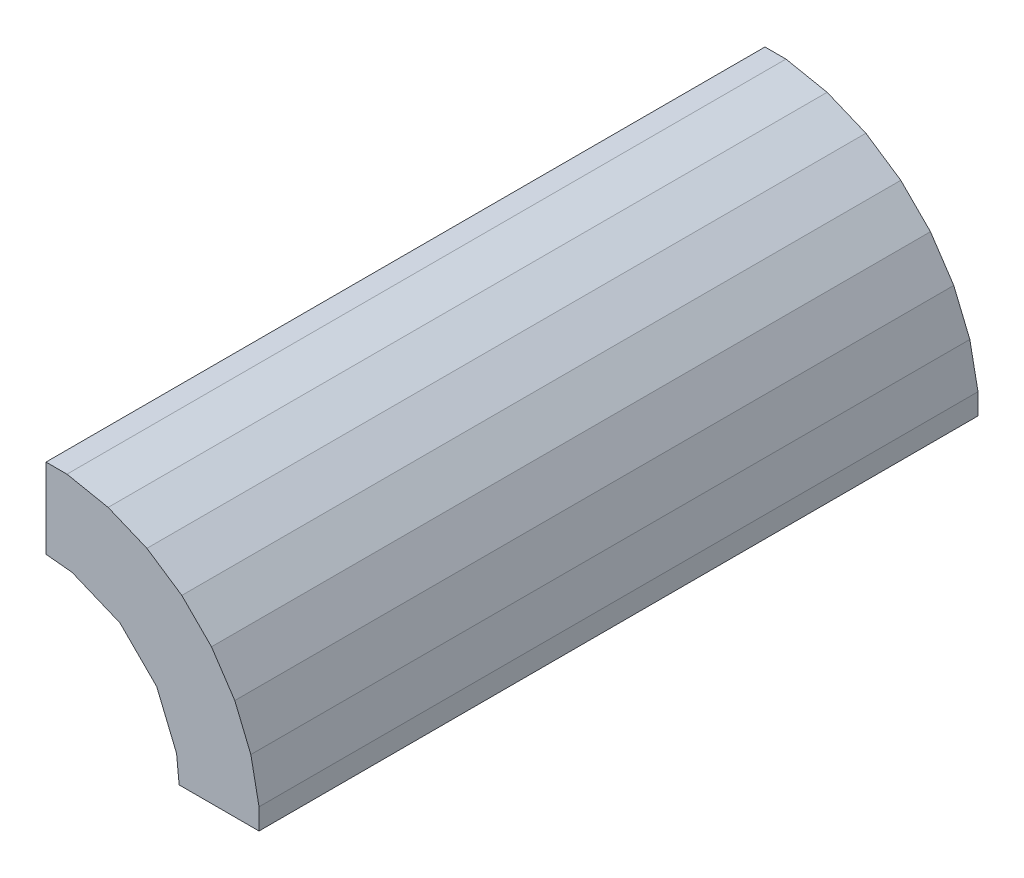
ISO-10303-21;
HEADER;
FILE_DESCRIPTION(('STEP AP214'),'2;1');
FILE_NAME('part.step','',(''),(''),'','','');
FILE_SCHEMA(('AUTOMOTIVE_DESIGN { 1 0 10303 214 1 1 1 1 }'));
ENDSEC;
DATA;
#1=APPLICATION_CONTEXT('core data for automotive mechanical design processes');
#2=APPLICATION_PROTOCOL_DEFINITION('international standard','automotive_design',2000,#1);
#3=PRODUCT_CONTEXT('',#1,'mechanical');
#4=PRODUCT('Part','Part','',(#3));
#5=PRODUCT_RELATED_PRODUCT_CATEGORY('part','',(#4));
#6=PRODUCT_DEFINITION_FORMATION('','',#4);
#7=PRODUCT_DEFINITION_CONTEXT('part definition',#1,'design');
#8=PRODUCT_DEFINITION('design','',#6,#7);
#9=PRODUCT_DEFINITION_SHAPE('','',#8);
#10=(LENGTH_UNIT() NAMED_UNIT(*) SI_UNIT(.MILLI.,.METRE.));
#11=(NAMED_UNIT(*) PLANE_ANGLE_UNIT() SI_UNIT($,.RADIAN.));
#12=(NAMED_UNIT(*) SI_UNIT($,.STERADIAN.) SOLID_ANGLE_UNIT());
#13=UNCERTAINTY_MEASURE_WITH_UNIT(LENGTH_MEASURE(1.E-05),#10,'distance_accuracy_value','');
#14=(GEOMETRIC_REPRESENTATION_CONTEXT(3) GLOBAL_UNCERTAINTY_ASSIGNED_CONTEXT((#13)) GLOBAL_UNIT_ASSIGNED_CONTEXT((#10,
#11,#12)) REPRESENTATION_CONTEXT('',''));
#15=CARTESIAN_POINT('',(0.,0.,0.));
#16=DIRECTION('',(0.,0.,1.));
#17=DIRECTION('',(1.,0.,0.));
#18=AXIS2_PLACEMENT_3D('',#15,#16,#17);
#19=CARTESIAN_POINT('',(11.395000117764,12.044998154824,0.));
#20=DIRECTION('',(0.,1.,0.));
#21=DIRECTION('',(1.,0.,0.));
#22=AXIS2_PLACEMENT_3D('',#19,#20,#21);
#23=PLANE('',#22);
#24=DIRECTION('',(0.,0.,1.));
#25=VECTOR('',#24,1.);
#26=CARTESIAN_POINT('',(11.395000117764,12.044998154824,0.));
#27=LINE('',#26,#25);
#28=CARTESIAN_POINT('',(11.395000117764,12.044998154824,0.));
#29=VERTEX_POINT('',#28);
#30=CARTESIAN_POINT('',(11.395000117764,12.044998154824,2.69999968));
#31=VERTEX_POINT('',#30);
#32=EDGE_CURVE('E11',#29,#31,#27,.T.);
#33=ORIENTED_EDGE('',*,*,#32,.T.);
#34=DIRECTION('',(1.,0.,0.));
#35=VECTOR('',#34,1.);
#36=CARTESIAN_POINT('',(11.395000117764,12.044998154824,2.69999968));
#37=LINE('',#36,#35);
#38=CARTESIAN_POINT('',(11.473790917764,12.044998154824,2.69999968));
#39=VERTEX_POINT('',#38);
#40=EDGE_CURVE('E24',#31,#39,#37,.T.);
#41=ORIENTED_EDGE('',*,*,#40,.T.);
#42=DIRECTION('',(0.,0.,1.));
#43=VECTOR('',#42,1.);
#44=CARTESIAN_POINT('',(11.473790917764,12.044998154824,0.));
#45=LINE('',#44,#43);
#46=CARTESIAN_POINT('',(11.473790917764,12.044998154824,0.));
#47=VERTEX_POINT('',#46);
#48=EDGE_CURVE('E253',#47,#39,#45,.T.);
#49=ORIENTED_EDGE('',*,*,#48,.F.);
#50=DIRECTION('',(1.,0.,0.));
#51=VECTOR('',#50,1.);
#52=CARTESIAN_POINT('',(11.395000117764,12.044998154824,0.));
#53=LINE('',#52,#51);
#54=EDGE_CURVE('E251',#29,#47,#53,.T.);
#55=ORIENTED_EDGE('',*,*,#54,.F.);
#56=EDGE_LOOP('',(#33,#41,#49,#55));
#57=FACE_BOUND('',#56,.T.);
#58=ADVANCED_FACE('F17',(#57),#23,.T.);
#59=CARTESIAN_POINT('',(11.473790917764,12.044998154824,0.));
#60=DIRECTION('',(0.195093150754009,0.980784717728041,0.));
#61=DIRECTION('',(0.,0.,-1.));
#62=AXIS2_PLACEMENT_3D('',#59,#60,#61);
#63=PLANE('',#62);
#64=ORIENTED_EDGE('',*,*,#48,.T.);
#65=DIRECTION('',(0.980784717728041,-0.195093150754009,0.));
#66=VECTOR('',#65,1.);
#67=CARTESIAN_POINT('',(11.473790917764,12.044998154824,2.69999968));
#68=LINE('',#67,#66);
#69=CARTESIAN_POINT('',(11.628349917764,12.014253994824,2.69999968));
#70=VERTEX_POINT('',#69);
#71=EDGE_CURVE('E249',#39,#70,#68,.T.);
#72=ORIENTED_EDGE('',*,*,#71,.T.);
#73=DIRECTION('',(0.,0.,1.));
#74=VECTOR('',#73,1.);
#75=CARTESIAN_POINT('',(11.628349917764,12.014253994824,0.));
#76=LINE('',#75,#74);
#77=CARTESIAN_POINT('',(11.628349917764,12.014253994824,0.));
#78=VERTEX_POINT('',#77);
#79=EDGE_CURVE('E246',#78,#70,#76,.T.);
#80=ORIENTED_EDGE('',*,*,#79,.F.);
#81=DIRECTION('',(0.980784717728041,-0.195093150754009,0.));
#82=VECTOR('',#81,1.);
#83=CARTESIAN_POINT('',(11.473790917764,12.044998154824,0.));
#84=LINE('',#83,#82);
#85=EDGE_CURVE('E243',#47,#78,#84,.T.);
#86=ORIENTED_EDGE('',*,*,#85,.F.);
#87=EDGE_LOOP('',(#64,#72,#80,#86));
#88=FACE_BOUND('',#87,.T.);
#89=ADVANCED_FACE('F259',(#88),#63,.T.);
#90=CARTESIAN_POINT('',(11.628349917764,12.014253994824,0.));
#91=DIRECTION('',(0.382692963925958,0.9238755843519,0.));
#92=DIRECTION('',(0.,0.,-1.));
#93=AXIS2_PLACEMENT_3D('',#90,#91,#92);
#94=PLANE('',#93);
#95=ORIENTED_EDGE('',*,*,#79,.T.);
#96=DIRECTION('',(0.9238755843519,-0.382692963925958,0.));
#97=VECTOR('',#96,1.);
#98=CARTESIAN_POINT('',(11.628349917764,12.014253994824,2.69999968));
#99=LINE('',#98,#97);
#100=CARTESIAN_POINT('',(11.773940177764,11.953946774824,2.69999968));
#101=VERTEX_POINT('',#100);
#102=EDGE_CURVE('E241',#70,#101,#99,.T.);
#103=ORIENTED_EDGE('',*,*,#102,.T.);
#104=DIRECTION('',(0.,0.,1.));
#105=VECTOR('',#104,1.);
#106=CARTESIAN_POINT('',(11.773940177764,11.953946774824,0.));
#107=LINE('',#106,#105);
#108=CARTESIAN_POINT('',(11.773940177764,11.953946774824,0.));
#109=VERTEX_POINT('',#108);
#110=EDGE_CURVE('E238',#109,#101,#107,.T.);
#111=ORIENTED_EDGE('',*,*,#110,.F.);
#112=DIRECTION('',(0.9238755843519,-0.382692963925958,0.));
#113=VECTOR('',#112,1.);
#114=CARTESIAN_POINT('',(11.628349917764,12.014253994824,0.));
#115=LINE('',#114,#113);
#116=EDGE_CURVE('E235',#78,#109,#115,.T.);
#117=ORIENTED_EDGE('',*,*,#116,.F.);
#118=EDGE_LOOP('',(#95,#103,#111,#117));
#119=FACE_BOUND('',#118,.T.);
#120=ADVANCED_FACE('F265',(#119),#94,.T.);
#121=CARTESIAN_POINT('',(11.773940177764,11.953946774824,0.));
#122=DIRECTION('',(0.555562842653059,0.831474550340089,0.));
#123=DIRECTION('',(0.,0.,-1.));
#124=AXIS2_PLACEMENT_3D('',#121,#122,#123);
#125=PLANE('',#124);
#126=ORIENTED_EDGE('',*,*,#110,.T.);
#127=DIRECTION('',(0.831474550340089,-0.555562842653059,0.));
#128=VECTOR('',#127,1.);
#129=CARTESIAN_POINT('',(11.773940177764,11.953946774824,2.69999968));
#130=LINE('',#129,#128);
#131=CARTESIAN_POINT('',(11.904968617764,11.866398054824,2.69999968));
#132=VERTEX_POINT('',#131);
#133=EDGE_CURVE('E233',#101,#132,#130,.T.);
#134=ORIENTED_EDGE('',*,*,#133,.T.);
#135=DIRECTION('',(0.,0.,1.));
#136=VECTOR('',#135,1.);
#137=CARTESIAN_POINT('',(11.904968617764,11.866398054824,0.));
#138=LINE('',#137,#136);
#139=CARTESIAN_POINT('',(11.904968617764,11.866398054824,0.));
#140=VERTEX_POINT('',#139);
#141=EDGE_CURVE('E230',#140,#132,#138,.T.);
#142=ORIENTED_EDGE('',*,*,#141,.F.);
#143=DIRECTION('',(0.831474550340089,-0.555562842653059,0.));
#144=VECTOR('',#143,1.);
#145=CARTESIAN_POINT('',(11.773940177764,11.953946774824,0.));
#146=LINE('',#145,#144);
#147=EDGE_CURVE('E227',#109,#140,#146,.T.);
#148=ORIENTED_EDGE('',*,*,#147,.F.);
#149=EDGE_LOOP('',(#126,#134,#142,#148));
#150=FACE_BOUND('',#149,.T.);
#151=ADVANCED_FACE('F269',(#150),#125,.T.);
#152=CARTESIAN_POINT('',(11.904968617764,11.866398054824,0.));
#153=DIRECTION('',(0.707106781186548,0.707106781186548,0.));
#154=DIRECTION('',(0.,0.,-1.));
#155=AXIS2_PLACEMENT_3D('',#152,#153,#154);
#156=PLANE('',#155);
#157=ORIENTED_EDGE('',*,*,#141,.T.);
#158=DIRECTION('',(0.707106781186548,-0.707106781186548,0.));
#159=VECTOR('',#158,1.);
#160=CARTESIAN_POINT('',(11.904968617764,11.866398054824,2.69999968));
#161=LINE('',#160,#159);
#162=CARTESIAN_POINT('',(12.016398417764,11.754968254824,2.69999968));
#163=VERTEX_POINT('',#162);
#164=EDGE_CURVE('E225',#132,#163,#161,.T.);
#165=ORIENTED_EDGE('',*,*,#164,.T.);
#166=DIRECTION('',(0.,0.,1.));
#167=VECTOR('',#166,1.);
#168=CARTESIAN_POINT('',(12.016398417764,11.754968254824,0.));
#169=LINE('',#168,#167);
#170=CARTESIAN_POINT('',(12.016398417764,11.754968254824,0.));
#171=VERTEX_POINT('',#170);
#172=EDGE_CURVE('E222',#171,#163,#169,.T.);
#173=ORIENTED_EDGE('',*,*,#172,.F.);
#174=DIRECTION('',(0.707106781186548,-0.707106781186548,0.));
#175=VECTOR('',#174,1.);
#176=CARTESIAN_POINT('',(11.904968617764,11.866398054824,0.));
#177=LINE('',#176,#175);
#178=EDGE_CURVE('E219',#140,#171,#177,.T.);
#179=ORIENTED_EDGE('',*,*,#178,.F.);
#180=EDGE_LOOP('',(#157,#165,#173,#179));
#181=FACE_BOUND('',#180,.T.);
#182=ADVANCED_FACE('F273',(#181),#156,.T.);
#183=CARTESIAN_POINT('',(12.016398417764,11.754968254824,0.));
#184=DIRECTION('',(0.831474550340089,0.555562842653059,0.));
#185=DIRECTION('',(0.,0.,-1.));
#186=AXIS2_PLACEMENT_3D('',#183,#184,#185);
#187=PLANE('',#186);
#188=ORIENTED_EDGE('',*,*,#172,.T.);
#189=DIRECTION('',(0.555562842653059,-0.831474550340089,0.));
#190=VECTOR('',#189,1.);
#191=CARTESIAN_POINT('',(12.016398417764,11.754968254824,2.69999968));
#192=LINE('',#191,#190);
#193=CARTESIAN_POINT('',(12.103947137764,11.623939814824,2.69999968));
#194=VERTEX_POINT('',#193);
#195=EDGE_CURVE('E217',#163,#194,#192,.T.);
#196=ORIENTED_EDGE('',*,*,#195,.T.);
#197=DIRECTION('',(0.,0.,1.));
#198=VECTOR('',#197,1.);
#199=CARTESIAN_POINT('',(12.103947137764,11.623939814824,0.));
#200=LINE('',#199,#198);
#201=CARTESIAN_POINT('',(12.103947137764,11.623939814824,0.));
#202=VERTEX_POINT('',#201);
#203=EDGE_CURVE('E214',#202,#194,#200,.T.);
#204=ORIENTED_EDGE('',*,*,#203,.F.);
#205=DIRECTION('',(0.555562842653059,-0.831474550340089,0.));
#206=VECTOR('',#205,1.);
#207=CARTESIAN_POINT('',(12.016398417764,11.754968254824,0.));
#208=LINE('',#207,#206);
#209=EDGE_CURVE('E211',#171,#202,#208,.T.);
#210=ORIENTED_EDGE('',*,*,#209,.F.);
#211=EDGE_LOOP('',(#188,#196,#204,#210));
#212=FACE_BOUND('',#211,.T.);
#213=ADVANCED_FACE('F276',(#212),#187,.T.);
#214=CARTESIAN_POINT('',(12.103947137764,11.623939814824,0.));
#215=DIRECTION('',(0.9238755843519,0.382692963925958,0.));
#216=DIRECTION('',(0.,0.,-1.));
#217=AXIS2_PLACEMENT_3D('',#214,#215,#216);
#218=PLANE('',#217);
#219=ORIENTED_EDGE('',*,*,#203,.T.);
#220=DIRECTION('',(0.382692963925958,-0.9238755843519,0.));
#221=VECTOR('',#220,1.);
#222=CARTESIAN_POINT('',(12.103947137764,11.623939814824,2.69999968));
#223=LINE('',#222,#221);
#224=CARTESIAN_POINT('',(12.164254357764,11.478349554824,2.69999968));
#225=VERTEX_POINT('',#224);
#226=EDGE_CURVE('E209',#194,#225,#223,.T.);
#227=ORIENTED_EDGE('',*,*,#226,.T.);
#228=DIRECTION('',(0.,0.,1.));
#229=VECTOR('',#228,1.);
#230=CARTESIAN_POINT('',(12.164254357764,11.478349554824,0.));
#231=LINE('',#230,#229);
#232=CARTESIAN_POINT('',(12.164254357764,11.478349554824,0.));
#233=VERTEX_POINT('',#232);
#234=EDGE_CURVE('E206',#233,#225,#231,.T.);
#235=ORIENTED_EDGE('',*,*,#234,.F.);
#236=DIRECTION('',(0.382692963925958,-0.9238755843519,0.));
#237=VECTOR('',#236,1.);
#238=CARTESIAN_POINT('',(12.103947137764,11.623939814824,0.));
#239=LINE('',#238,#237);
#240=EDGE_CURVE('E203',#202,#233,#239,.T.);
#241=ORIENTED_EDGE('',*,*,#240,.F.);
#242=EDGE_LOOP('',(#219,#227,#235,#241));
#243=FACE_BOUND('',#242,.T.);
#244=ADVANCED_FACE('F281',(#243),#218,.T.);
#245=CARTESIAN_POINT('',(12.164254357764,11.478349554824,0.));
#246=DIRECTION('',(0.980784717728041,0.195093150754009,0.));
#247=DIRECTION('',(0.,0.,-1.));
#248=AXIS2_PLACEMENT_3D('',#245,#246,#247);
#249=PLANE('',#248);
#250=ORIENTED_EDGE('',*,*,#234,.T.);
#251=DIRECTION('',(0.195093150754009,-0.980784717728041,0.));
#252=VECTOR('',#251,1.);
#253=CARTESIAN_POINT('',(12.164254357764,11.478349554824,2.69999968));
#254=LINE('',#253,#252);
#255=CARTESIAN_POINT('',(12.194998517764,11.323790554824,2.69999968));
#256=VERTEX_POINT('',#255);
#257=EDGE_CURVE('E201',#225,#256,#254,.T.);
#258=ORIENTED_EDGE('',*,*,#257,.T.);
#259=DIRECTION('',(0.,0.,1.));
#260=VECTOR('',#259,1.);
#261=CARTESIAN_POINT('',(12.194998517764,11.323790554824,0.));
#262=LINE('',#261,#260);
#263=CARTESIAN_POINT('',(12.194998517764,11.323790554824,0.));
#264=VERTEX_POINT('',#263);
#265=EDGE_CURVE('E198',#264,#256,#262,.T.);
#266=ORIENTED_EDGE('',*,*,#265,.F.);
#267=DIRECTION('',(0.195093150754009,-0.980784717728041,0.));
#268=VECTOR('',#267,1.);
#269=CARTESIAN_POINT('',(12.164254357764,11.478349554824,0.));
#270=LINE('',#269,#268);
#271=EDGE_CURVE('E195',#233,#264,#270,.T.);
#272=ORIENTED_EDGE('',*,*,#271,.F.);
#273=EDGE_LOOP('',(#250,#258,#266,#272));
#274=FACE_BOUND('',#273,.T.);
#275=ADVANCED_FACE('F285',(#274),#249,.T.);
#276=CARTESIAN_POINT('',(12.194998517764,11.323790554824,0.));
#277=DIRECTION('',(1.,0.,0.));
#278=DIRECTION('',(0.,1.,0.));
#279=AXIS2_PLACEMENT_3D('',#276,#277,#278);
#280=PLANE('',#279);
#281=ORIENTED_EDGE('',*,*,#265,.T.);
#282=DIRECTION('',(0.,-1.,0.));
#283=VECTOR('',#282,1.);
#284=CARTESIAN_POINT('',(12.194998517764,11.323790554824,2.69999968));
#285=LINE('',#284,#283);
#286=CARTESIAN_POINT('',(12.194998517764,11.244999754824,2.69999968));
#287=VERTEX_POINT('',#286);
#288=EDGE_CURVE('E193',#256,#287,#285,.T.);
#289=ORIENTED_EDGE('',*,*,#288,.T.);
#290=DIRECTION('',(0.,0.,1.));
#291=VECTOR('',#290,1.);
#292=CARTESIAN_POINT('',(12.194998517764,11.244999754824,0.));
#293=LINE('',#292,#291);
#294=CARTESIAN_POINT('',(12.194998517764,11.244999754824,0.));
#295=VERTEX_POINT('',#294);
#296=EDGE_CURVE('E190',#295,#287,#293,.T.);
#297=ORIENTED_EDGE('',*,*,#296,.F.);
#298=DIRECTION('',(0.,-1.,0.));
#299=VECTOR('',#298,1.);
#300=CARTESIAN_POINT('',(12.194998517764,11.323790554824,0.));
#301=LINE('',#300,#299);
#302=EDGE_CURVE('E187',#264,#295,#301,.T.);
#303=ORIENTED_EDGE('',*,*,#302,.F.);
#304=EDGE_LOOP('',(#281,#289,#297,#303));
#305=FACE_BOUND('',#304,.T.);
#306=ADVANCED_FACE('F289',(#305),#280,.T.);
#307=CARTESIAN_POINT('',(12.194998517764,11.244999754824,0.));
#308=DIRECTION('',(0.,-1.,0.));
#309=DIRECTION('',(0.,0.,-1.));
#310=AXIS2_PLACEMENT_3D('',#307,#308,#309);
#311=PLANE('',#310);
#312=ORIENTED_EDGE('',*,*,#296,.T.);
#313=DIRECTION('',(-1.,0.,0.));
#314=VECTOR('',#313,1.);
#315=CARTESIAN_POINT('',(12.194998517764,11.244999754824,2.69999968));
#316=LINE('',#315,#314);
#317=CARTESIAN_POINT('',(11.894999117764,11.244999754824,2.69999968));
#318=VERTEX_POINT('',#317);
#319=EDGE_CURVE('E185',#287,#318,#316,.T.);
#320=ORIENTED_EDGE('',*,*,#319,.T.);
#321=DIRECTION('',(0.,0.,1.));
#322=VECTOR('',#321,1.);
#323=CARTESIAN_POINT('',(11.894999117764,11.244999754824,0.));
#324=LINE('',#323,#322);
#325=CARTESIAN_POINT('',(11.894999117764,11.244999754824,0.));
#326=VERTEX_POINT('',#325);
#327=EDGE_CURVE('E182',#326,#318,#324,.T.);
#328=ORIENTED_EDGE('',*,*,#327,.F.);
#329=DIRECTION('',(-1.,0.,0.));
#330=VECTOR('',#329,1.);
#331=CARTESIAN_POINT('',(12.194998517764,11.244999754824,0.));
#332=LINE('',#331,#330);
#333=EDGE_CURVE('E179',#295,#326,#332,.T.);
#334=ORIENTED_EDGE('',*,*,#333,.F.);
#335=EDGE_LOOP('',(#312,#320,#328,#334));
#336=FACE_BOUND('',#335,.T.);
#337=ADVANCED_FACE('F292',(#336),#311,.T.);
#338=CARTESIAN_POINT('',(11.894999117764,11.244999754824,0.));
#339=DIRECTION('',(-0.995183122300617,-0.0980334284211023,0.));
#340=DIRECTION('',(-0.0980334284211023,0.995183122300617,0.));
#341=AXIS2_PLACEMENT_3D('',#338,#339,#340);
#342=PLANE('',#341);
#343=ORIENTED_EDGE('',*,*,#327,.T.);
#344=DIRECTION('',(-0.0980334284211023,0.995183122300617,0.));
#345=VECTOR('',#344,1.);
#346=CARTESIAN_POINT('',(11.894999117764,11.244999754824,2.69999968));
#347=LINE('',#346,#345);
#348=CARTESIAN_POINT('',(11.885390297764,11.342543374824,2.69999968));
#349=VERTEX_POINT('',#348);
#350=EDGE_CURVE('E177',#318,#349,#347,.T.);
#351=ORIENTED_EDGE('',*,*,#350,.T.);
#352=DIRECTION('',(0.,0.,1.));
#353=VECTOR('',#352,1.);
#354=CARTESIAN_POINT('',(11.885390297764,11.342543374824,0.));
#355=LINE('',#354,#353);
#356=CARTESIAN_POINT('',(11.885390297764,11.342543374824,0.));
#357=VERTEX_POINT('',#356);
#358=EDGE_CURVE('E174',#357,#349,#355,.T.);
#359=ORIENTED_EDGE('',*,*,#358,.F.);
#360=DIRECTION('',(-0.0980334284211023,0.995183122300617,0.));
#361=VECTOR('',#360,1.);
#362=CARTESIAN_POINT('',(11.894999117764,11.244999754824,0.));
#363=LINE('',#362,#361);
#364=EDGE_CURVE('E171',#326,#357,#363,.T.);
#365=ORIENTED_EDGE('',*,*,#364,.F.);
#366=EDGE_LOOP('',(#343,#351,#359,#365));
#367=FACE_BOUND('',#366,.T.);
#368=ADVANCED_FACE('F297',(#367),#342,.T.);
#369=CARTESIAN_POINT('',(11.885390297764,11.342543374824,0.));
#370=DIRECTION('',(-0.923879572096044,-0.382683336799019,0.));
#371=DIRECTION('',(-0.382683336799019,0.923879572096044,0.));
#372=AXIS2_PLACEMENT_3D('',#369,#370,#371);
#373=PLANE('',#372);
#374=ORIENTED_EDGE('',*,*,#358,.T.);
#375=DIRECTION('',(-0.382683336799019,0.923879572096044,0.));
#376=VECTOR('',#375,1.);
#377=CARTESIAN_POINT('',(11.885390297764,11.342543374824,2.69999968));
#378=LINE('',#377,#376);
#379=CARTESIAN_POINT('',(11.810732077764,11.522784314824,2.69999968));
#380=VERTEX_POINT('',#379);
#381=EDGE_CURVE('E169',#349,#380,#378,.T.);
#382=ORIENTED_EDGE('',*,*,#381,.T.);
#383=DIRECTION('',(0.,0.,1.));
#384=VECTOR('',#383,1.);
#385=CARTESIAN_POINT('',(11.810732077764,11.522784314824,0.));
#386=LINE('',#385,#384);
#387=CARTESIAN_POINT('',(11.810732077764,11.522784314824,0.));
#388=VERTEX_POINT('',#387);
#389=EDGE_CURVE('E166',#388,#380,#386,.T.);
#390=ORIENTED_EDGE('',*,*,#389,.F.);
#391=DIRECTION('',(-0.382683336799019,0.923879572096044,0.));
#392=VECTOR('',#391,1.);
#393=CARTESIAN_POINT('',(11.885390297764,11.342543374824,0.));
#394=LINE('',#393,#392);
#395=EDGE_CURVE('E163',#357,#388,#394,.T.);
#396=ORIENTED_EDGE('',*,*,#395,.F.);
#397=EDGE_LOOP('',(#374,#382,#390,#396));
#398=FACE_BOUND('',#397,.T.);
#399=ADVANCED_FACE('F301',(#398),#373,.T.);
#400=CARTESIAN_POINT('',(11.810732077764,11.522784314824,0.));
#401=DIRECTION('',(-0.707106781186548,-0.707106781186548,0.));
#402=DIRECTION('',(-0.707106781186548,0.707106781186548,0.));
#403=AXIS2_PLACEMENT_3D('',#400,#401,#402);
#404=PLANE('',#403);
#405=ORIENTED_EDGE('',*,*,#389,.T.);
#406=DIRECTION('',(-0.707106781186548,0.707106781186548,0.));
#407=VECTOR('',#406,1.);
#408=CARTESIAN_POINT('',(11.810732077764,11.522784314824,2.69999968));
#409=LINE('',#408,#407);
#410=CARTESIAN_POINT('',(11.672784677764,11.660731714824,2.69999968));
#411=VERTEX_POINT('',#410);
#412=EDGE_CURVE('E161',#380,#411,#409,.T.);
#413=ORIENTED_EDGE('',*,*,#412,.T.);
#414=DIRECTION('',(0.,0.,1.));
#415=VECTOR('',#414,1.);
#416=CARTESIAN_POINT('',(11.672784677764,11.660731714824,0.));
#417=LINE('',#416,#415);
#418=CARTESIAN_POINT('',(11.672784677764,11.660731714824,0.));
#419=VERTEX_POINT('',#418);
#420=EDGE_CURVE('E158',#419,#411,#417,.T.);
#421=ORIENTED_EDGE('',*,*,#420,.F.);
#422=DIRECTION('',(-0.707106781186548,0.707106781186548,0.));
#423=VECTOR('',#422,1.);
#424=CARTESIAN_POINT('',(11.810732077764,11.522784314824,0.));
#425=LINE('',#424,#423);
#426=EDGE_CURVE('E156',#388,#419,#425,.T.);
#427=ORIENTED_EDGE('',*,*,#426,.F.);
#428=EDGE_LOOP('',(#405,#413,#421,#427));
#429=FACE_BOUND('',#428,.T.);
#430=ADVANCED_FACE('F304',(#429),#404,.T.);
#431=CARTESIAN_POINT('',(11.672784677764,11.660731714824,0.));
#432=DIRECTION('',(-0.382683336799019,-0.923879572096044,0.));
#433=DIRECTION('',(-0.923879572096044,0.382683336799019,0.));
#434=AXIS2_PLACEMENT_3D('',#431,#432,#433);
#435=PLANE('',#434);
#436=ORIENTED_EDGE('',*,*,#420,.T.);
#437=DIRECTION('',(-0.923879572096044,0.382683336799019,0.));
#438=VECTOR('',#437,1.);
#439=CARTESIAN_POINT('',(11.672784677764,11.660731714824,2.69999968));
#440=LINE('',#439,#438);
#441=CARTESIAN_POINT('',(11.492543737764,11.735389934824,2.69999968));
#442=VERTEX_POINT('',#441);
#443=EDGE_CURVE('E154',#411,#442,#440,.T.);
#444=ORIENTED_EDGE('',*,*,#443,.T.);
#445=DIRECTION('',(0.,0.,1.));
#446=VECTOR('',#445,1.);
#447=CARTESIAN_POINT('',(11.492543737764,11.735389934824,0.));
#448=LINE('',#447,#446);
#449=CARTESIAN_POINT('',(11.492543737764,11.735389934824,0.));
#450=VERTEX_POINT('',#449);
#451=EDGE_CURVE('E152',#450,#442,#448,.T.);
#452=ORIENTED_EDGE('',*,*,#451,.F.);
#453=DIRECTION('',(-0.923879572096044,0.382683336799019,0.));
#454=VECTOR('',#453,1.);
#455=CARTESIAN_POINT('',(11.672784677764,11.660731714824,0.));
#456=LINE('',#455,#454);
#457=EDGE_CURVE('E143',#419,#450,#456,.T.);
#458=ORIENTED_EDGE('',*,*,#457,.F.);
#459=EDGE_LOOP('',(#436,#444,#452,#458));
#460=FACE_BOUND('',#459,.T.);
#461=ADVANCED_FACE('F307',(#460),#435,.T.);
#462=CARTESIAN_POINT('',(11.492543737764,11.735389934824,0.));
#463=DIRECTION('',(-0.0980334284211023,-0.995183122300617,0.));
#464=DIRECTION('',(-0.995183122300617,0.0980334284211023,0.));
#465=AXIS2_PLACEMENT_3D('',#462,#463,#464);
#466=PLANE('',#465);
#467=ORIENTED_EDGE('',*,*,#451,.T.);
#468=DIRECTION('',(-0.995183122300617,0.0980334284211023,0.));
#469=VECTOR('',#468,1.);
#470=CARTESIAN_POINT('',(11.492543737764,11.735389934824,2.69999968));
#471=LINE('',#470,#469);
#472=CARTESIAN_POINT('',(11.395000117764,11.744998754824,2.69999968));
#473=VERTEX_POINT('',#472);
#474=EDGE_CURVE('E132',#442,#473,#471,.T.);
#475=ORIENTED_EDGE('',*,*,#474,.T.);
#476=DIRECTION('',(0.,0.,1.));
#477=VECTOR('',#476,1.);
#478=CARTESIAN_POINT('',(11.395000117764,11.744998754824,0.));
#479=LINE('',#478,#477);
#480=CARTESIAN_POINT('',(11.395000117764,11.744998754824,0.));
#481=VERTEX_POINT('',#480);
#482=EDGE_CURVE('E126',#481,#473,#479,.T.);
#483=ORIENTED_EDGE('',*,*,#482,.F.);
#484=DIRECTION('',(-0.995183122300617,0.0980334284211023,0.));
#485=VECTOR('',#484,1.);
#486=CARTESIAN_POINT('',(11.492543737764,11.735389934824,0.));
#487=LINE('',#486,#485);
#488=EDGE_CURVE('E130',#450,#481,#487,.T.);
#489=ORIENTED_EDGE('',*,*,#488,.F.);
#490=EDGE_LOOP('',(#467,#475,#483,#489));
#491=FACE_BOUND('',#490,.T.);
#492=ADVANCED_FACE('F129',(#491),#466,.T.);
#493=CARTESIAN_POINT('',(11.395000117764,11.744998754824,0.));
#494=DIRECTION('',(-1.,0.,0.));
#495=DIRECTION('',(0.,0.,1.));
#496=AXIS2_PLACEMENT_3D('',#493,#494,#495);
#497=PLANE('',#496);
#498=ORIENTED_EDGE('',*,*,#482,.T.);
#499=DIRECTION('',(0.,1.,0.));
#500=VECTOR('',#499,1.);
#501=CARTESIAN_POINT('',(11.395000117764,11.744998754824,2.69999968));
#502=LINE('',#501,#500);
#503=EDGE_CURVE('E144',#473,#31,#502,.T.);
#504=ORIENTED_EDGE('',*,*,#503,.T.);
#505=ORIENTED_EDGE('',*,*,#32,.F.);
#506=DIRECTION('',(0.,1.,0.));
#507=VECTOR('',#506,1.);
#508=CARTESIAN_POINT('',(11.395000117764,11.744998754824,0.));
#509=LINE('',#508,#507);
#510=EDGE_CURVE('E140',#481,#29,#509,.T.);
#511=ORIENTED_EDGE('',*,*,#510,.F.);
#512=EDGE_LOOP('',(#498,#504,#505,#511));
#513=FACE_BOUND('',#512,.T.);
#514=ADVANCED_FACE('F146',(#513),#497,.T.);
#515=CARTESIAN_POINT('',(11.395000117764,12.044998154824,0.));
#516=DIRECTION('',(0.,0.,1.));
#517=DIRECTION('',(1.,0.,0.));
#518=AXIS2_PLACEMENT_3D('',#515,#516,#517);
#519=PLANE('',#518);
#520=ORIENTED_EDGE('',*,*,#54,.T.);
#521=ORIENTED_EDGE('',*,*,#85,.T.);
#522=ORIENTED_EDGE('',*,*,#116,.T.);
#523=ORIENTED_EDGE('',*,*,#147,.T.);
#524=ORIENTED_EDGE('',*,*,#178,.T.);
#525=ORIENTED_EDGE('',*,*,#209,.T.);
#526=ORIENTED_EDGE('',*,*,#240,.T.);
#527=ORIENTED_EDGE('',*,*,#271,.T.);
#528=ORIENTED_EDGE('',*,*,#302,.T.);
#529=ORIENTED_EDGE('',*,*,#333,.T.);
#530=ORIENTED_EDGE('',*,*,#364,.T.);
#531=ORIENTED_EDGE('',*,*,#395,.T.);
#532=ORIENTED_EDGE('',*,*,#426,.T.);
#533=ORIENTED_EDGE('',*,*,#457,.T.);
#534=ORIENTED_EDGE('',*,*,#488,.T.);
#535=ORIENTED_EDGE('',*,*,#510,.T.);
#536=EDGE_LOOP('',(#520,#521,#522,#523,#524,#525,#526,#527,#528,#529,#530,#531,#532,#533,#534,#535));
#537=FACE_BOUND('',#536,.T.);
#538=ADVANCED_FACE('F139',(#537),#519,.F.);
#539=CARTESIAN_POINT('',(11.395000117764,12.044998154824,2.69999968));
#540=DIRECTION('',(0.,0.,1.));
#541=DIRECTION('',(1.,0.,0.));
#542=AXIS2_PLACEMENT_3D('',#539,#540,#541);
#543=PLANE('',#542);
#544=ORIENTED_EDGE('',*,*,#503,.F.);
#545=ORIENTED_EDGE('',*,*,#474,.F.);
#546=ORIENTED_EDGE('',*,*,#443,.F.);
#547=ORIENTED_EDGE('',*,*,#412,.F.);
#548=ORIENTED_EDGE('',*,*,#381,.F.);
#549=ORIENTED_EDGE('',*,*,#350,.F.);
#550=ORIENTED_EDGE('',*,*,#319,.F.);
#551=ORIENTED_EDGE('',*,*,#288,.F.);
#552=ORIENTED_EDGE('',*,*,#257,.F.);
#553=ORIENTED_EDGE('',*,*,#226,.F.);
#554=ORIENTED_EDGE('',*,*,#195,.F.);
#555=ORIENTED_EDGE('',*,*,#164,.F.);
#556=ORIENTED_EDGE('',*,*,#133,.F.);
#557=ORIENTED_EDGE('',*,*,#102,.F.);
#558=ORIENTED_EDGE('',*,*,#71,.F.);
#559=ORIENTED_EDGE('',*,*,#40,.F.);
#560=EDGE_LOOP('',(#544,#545,#546,#547,#548,#549,#550,#551,#552,#553,#554,#555,#556,#557,#558,#559));
#561=FACE_BOUND('',#560,.T.);
#562=ADVANCED_FACE('F261',(#561),#543,.T.);
#563=CLOSED_SHELL('',(#58,#89,#120,#151,#182,#213,#244,#275,#306,#337,#368,#399,#430,#461,#492,
#514,#538,#562));
#564=MANIFOLD_SOLID_BREP('B1',#563);
#565=ADVANCED_BREP_SHAPE_REPRESENTATION('',(#18,#564),#14);
#566=SHAPE_DEFINITION_REPRESENTATION(#9,#565);
ENDSEC;
END-ISO-10303-21;
